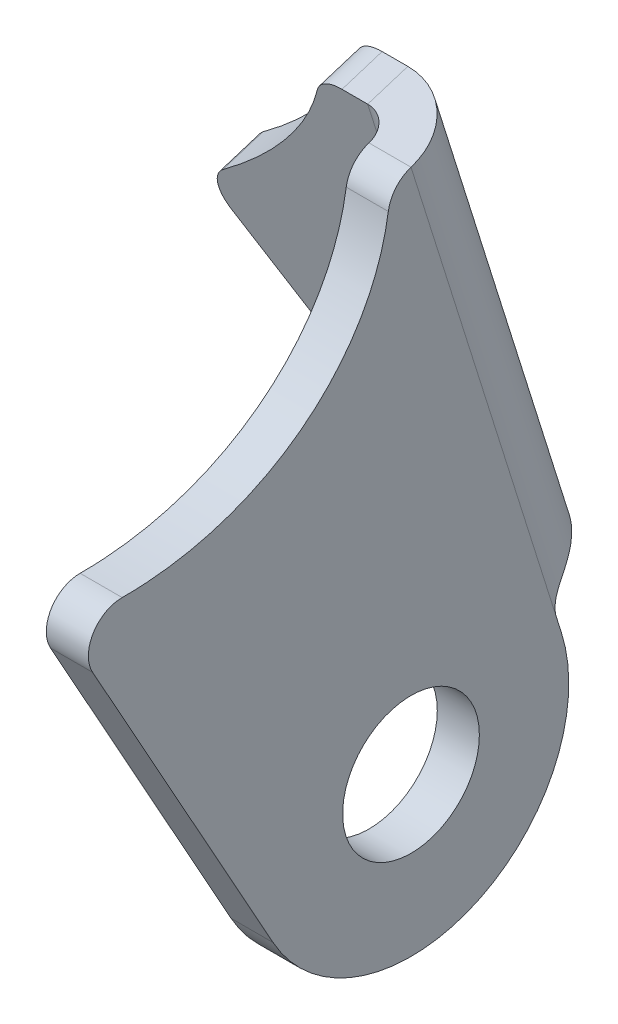
ISO-10303-21;
HEADER;
FILE_DESCRIPTION(('STEP AP214'),'2;1');
FILE_NAME('part.step','',(''),(''),'','','');
FILE_SCHEMA(('AUTOMOTIVE_DESIGN { 1 0 10303 214 1 1 1 1 }'));
ENDSEC;
DATA;
#1=APPLICATION_CONTEXT('core data for automotive mechanical design processes');
#2=APPLICATION_PROTOCOL_DEFINITION('international standard','automotive_design',2000,#1);
#3=PRODUCT_CONTEXT('',#1,'mechanical');
#4=PRODUCT('Part','Part','',(#3));
#5=PRODUCT_RELATED_PRODUCT_CATEGORY('part','',(#4));
#6=PRODUCT_DEFINITION_FORMATION('','',#4);
#7=PRODUCT_DEFINITION_CONTEXT('part definition',#1,'design');
#8=PRODUCT_DEFINITION('design','',#6,#7);
#9=PRODUCT_DEFINITION_SHAPE('','',#8);
#10=(LENGTH_UNIT() NAMED_UNIT(*) SI_UNIT(.MILLI.,.METRE.));
#11=(NAMED_UNIT(*) PLANE_ANGLE_UNIT() SI_UNIT($,.RADIAN.));
#12=(NAMED_UNIT(*) SI_UNIT($,.STERADIAN.) SOLID_ANGLE_UNIT());
#13=UNCERTAINTY_MEASURE_WITH_UNIT(LENGTH_MEASURE(1.E-05),#10,'distance_accuracy_value','');
#14=(GEOMETRIC_REPRESENTATION_CONTEXT(3) GLOBAL_UNCERTAINTY_ASSIGNED_CONTEXT((#13)) GLOBAL_UNIT_ASSIGNED_CONTEXT((#10,
#11,#12)) REPRESENTATION_CONTEXT('',''));
#15=CARTESIAN_POINT('',(0.,0.,0.));
#16=DIRECTION('',(0.,0.,1.));
#17=DIRECTION('',(1.,0.,0.));
#18=AXIS2_PLACEMENT_3D('',#15,#16,#17);
#19=CARTESIAN_POINT('',(472.519375,274.953876558,-153.162384053848));
#20=DIRECTION('',(0.,-0.953939201416946,-0.300000000000001));
#21=DIRECTION('',(0.,0.300000000000001,-0.953939201416946));
#22=AXIS2_PLACEMENT_3D('',#19,#20,#21);
#23=PLANE('',#22);
#24=DIRECTION('',(1.,0.,0.));
#25=VECTOR('',#24,1.);
#26=CARTESIAN_POINT('',(1.66533453693773E-12,274.953876558001,-153.162384053851));
#27=LINE('',#26,#25);
#28=CARTESIAN_POINT('',(469.380261929001,274.953876558,-153.162384053848));
#29=VERTEX_POINT('',#28);
#30=CARTESIAN_POINT('',(470.931875,274.953876558,-153.162384053848));
#31=VERTEX_POINT('',#30);
#32=EDGE_CURVE('E83',#29,#31,#27,.T.);
#33=ORIENTED_EDGE('',*,*,#32,.F.);
#34=DIRECTION('',(0.,0.300000000000001,-0.953939201416946));
#35=VECTOR('',#34,1.);
#36=CARTESIAN_POINT('',(469.380261929001,274.191876558,-150.739378482249));
#37=LINE('',#36,#35);
#38=CARTESIAN_POINT('',(469.380261929001,274.191876558,-150.739378482249));
#39=VERTEX_POINT('',#38);
#40=EDGE_CURVE('E210',#29,#39,#37,.F.);
#41=ORIENTED_EDGE('',*,*,#40,.T.);
#42=DIRECTION('',(-1.,0.,0.));
#43=VECTOR('',#42,1.);
#44=CARTESIAN_POINT('',(472.519375,274.191876558,-150.739378482249));
#45=LINE('',#44,#43);
#46=CARTESIAN_POINT('',(470.931875,274.191876558,-150.739378482249));
#47=VERTEX_POINT('',#46);
#48=EDGE_CURVE('E690',#39,#47,#45,.F.);
#49=ORIENTED_EDGE('',*,*,#48,.T.);
#50=DIRECTION('',(0.,0.300000000000001,-0.953939201416946));
#51=VECTOR('',#50,1.);
#52=CARTESIAN_POINT('',(470.931875,274.953876558,-153.162384053848));
#53=LINE('',#52,#51);
#54=EDGE_CURVE('E13',#47,#31,#53,.T.);
#55=ORIENTED_EDGE('',*,*,#54,.T.);
#56=EDGE_LOOP('',(#33,#41,#49,#55));
#57=FACE_BOUND('',#56,.T.);
#58=ADVANCED_FACE('F68',(#57),#23,.F.);
#59=CARTESIAN_POINT('',(447.119375,274.953876558,-153.162384053848));
#60=DIRECTION('',(0.795628229877527,0.577882258801892,0.181735562793793));
#61=DIRECTION('',(-0.587668443577206,0.809101847991676,0.));
#62=AXIS2_PLACEMENT_3D('',#59,#60,#61);
#63=PLANE('',#62);
#64=DIRECTION('',(-0.605785209312635,0.758980958234147,0.238688468963255));
#65=VECTOR('',#64,1.);
#66=CARTESIAN_POINT('',(387.309206328094,349.889313133379,-129.596279485317));
#67=LINE('',#66,#65);
#68=CARTESIAN_POINT('',(467.146965918821,249.861550246608,-161.053555610942));
#69=VERTEX_POINT('',#68);
#70=CARTESIAN_POINT('',(458.309753270916,260.933587035416,-157.571561127741));
#71=VERTEX_POINT('',#70);
#72=EDGE_CURVE('E693',#69,#71,#67,.T.);
#73=ORIENTED_EDGE('',*,*,#72,.F.);
#74=DIRECTION('',(0.,-0.300000000000001,0.953939201416945));
#75=VECTOR('',#74,1.);
#76=CARTESIAN_POINT('',(467.146965918821,249.861550246607,-161.053555610942));
#77=LINE('',#76,#75);
#78=CARTESIAN_POINT('',(467.146965918821,249.099550246607,-158.630550039343));
#79=VERTEX_POINT('',#78);
#80=EDGE_CURVE('E397',#69,#79,#77,.T.);
#81=ORIENTED_EDGE('',*,*,#80,.T.);
#82=DIRECTION('',(0.605785209312635,-0.758980958234147,-0.238688468963255));
#83=VECTOR('',#82,1.);
#84=CARTESIAN_POINT('',(447.119375,274.191876558,-150.739378482249));
#85=LINE('',#84,#83);
#86=CARTESIAN_POINT('',(458.309753270916,260.171587035416,-155.148555556142));
#87=VERTEX_POINT('',#86);
#88=EDGE_CURVE('E198',#79,#87,#85,.F.);
#89=ORIENTED_EDGE('',*,*,#88,.T.);
#90=DIRECTION('',(0.,0.3,-0.953939201416946));
#91=VECTOR('',#90,1.);
#92=CARTESIAN_POINT('',(458.309753270916,260.933587035416,-157.571561127741));
#93=LINE('',#92,#91);
#94=EDGE_CURVE('E390',#87,#71,#93,.T.);
#95=ORIENTED_EDGE('',*,*,#94,.T.);
#96=EDGE_LOOP('',(#73,#81,#89,#95));
#97=FACE_BOUND('',#96,.T.);
#98=ADVANCED_FACE('F367',(#97),#63,.F.);
#99=CARTESIAN_POINT('',(467.756875,249.097402539214,-161.293868947345));
#100=DIRECTION('',(0.,0.953939201416946,0.300000000000001));
#101=DIRECTION('',(0.,-0.300000000000001,0.953939201416946));
#102=AXIS2_PLACEMENT_3D('',#99,#100,#101);
#103=PLANE('',#102);
#104=DIRECTION('',(1.,0.,0.));
#105=VECTOR('',#104,1.);
#106=CARTESIAN_POINT('',(467.756875,248.335402539214,-158.870863375746));
#107=LINE('',#106,#105);
#108=CARTESIAN_POINT('',(470.931875,248.335402539214,-158.870863375746));
#109=VERTEX_POINT('',#108);
#110=CARTESIAN_POINT('',(468.763682481932,248.335402539214,-158.870863375746));
#111=VERTEX_POINT('',#110);
#112=EDGE_CURVE('E182',#109,#111,#107,.F.);
#113=ORIENTED_EDGE('',*,*,#112,.T.);
#114=DIRECTION('',(0.,-0.300000000000001,0.953939201416945));
#115=VECTOR('',#114,1.);
#116=CARTESIAN_POINT('',(468.763682481932,249.097402539214,-161.293868947345));
#117=LINE('',#116,#115);
#118=CARTESIAN_POINT('',(468.763682481932,249.097402539214,-161.293868947345));
#119=VERTEX_POINT('',#118);
#120=EDGE_CURVE('E395',#111,#119,#117,.F.);
#121=ORIENTED_EDGE('',*,*,#120,.T.);
#122=DIRECTION('',(-1.,0.,0.));
#123=VECTOR('',#122,1.);
#124=CARTESIAN_POINT('',(9.99200722162641E-13,249.097402539214,-161.293868947347));
#125=LINE('',#124,#123);
#126=CARTESIAN_POINT('',(470.931875,249.097402539214,-161.293868947345));
#127=VERTEX_POINT('',#126);
#128=EDGE_CURVE('E90',#127,#119,#125,.T.);
#129=ORIENTED_EDGE('',*,*,#128,.F.);
#130=DIRECTION('',(0.,0.300000000000001,-0.953939201416946));
#131=VECTOR('',#130,1.);
#132=CARTESIAN_POINT('',(470.931875,248.335402539214,-158.870863375746));
#133=LINE('',#132,#131);
#134=EDGE_CURVE('E179',#109,#127,#133,.T.);
#135=ORIENTED_EDGE('',*,*,#134,.F.);
#136=EDGE_LOOP('',(#113,#121,#129,#135));
#137=FACE_BOUND('',#136,.T.);
#138=ADVANCED_FACE('F181',(#137),#103,.F.);
#139=CARTESIAN_POINT('',(1.33226762955019E-12,68.578129589654,-218.064553918074));
#140=DIRECTION('',(0.,-0.300000000000001,0.953939201416946));
#141=DIRECTION('',(0.,-0.953939201416946,-0.300000000000001));
#142=AXIS2_PLACEMENT_3D('',#139,#140,#141);
#143=PLANE('',#142);
#144=ORIENTED_EDGE('',*,*,#128,.T.);
#145=CARTESIAN_POINT('',(468.763682481932,251.035806996493,-160.684268947345));
#146=DIRECTION('',(0.,-0.300000000000001,0.953939201416946));
#147=DIRECTION('',(0.953939201416945,0.286181760425085,0.0900000000000061));
#148=AXIS2_PLACEMENT_3D('',#145,#146,#147);
#149=CIRCLE('',#148,2.032);
#150=EDGE_CURVE('E406',#119,#69,#149,.F.);
#151=ORIENTED_EDGE('',*,*,#150,.T.);
#152=ORIENTED_EDGE('',*,*,#72,.T.);
#153=CARTESIAN_POINT('',(459.926469834027,262.107843785302,-157.202274464144));
#154=DIRECTION('',(0.,-0.300000000000001,0.953939201416946));
#155=DIRECTION('',(0.953939201416945,0.286181760425085,0.0900000000000061));
#156=AXIS2_PLACEMENT_3D('',#153,#154,#155);
#157=CIRCLE('',#156,2.032);
#158=CARTESIAN_POINT('',(458.615876339165,263.589176127829,-156.736416994299));
#159=VERTEX_POINT('',#158);
#160=EDGE_CURVE('E404',#71,#159,#157,.F.);
#161=ORIENTED_EDGE('',*,*,#160,.T.);
#162=CARTESIAN_POINT('',(433.841055893317,266.765989850092,-155.737355298058));
#163=DIRECTION('',(0.,-0.300000000000001,0.953939201416946));
#164=DIRECTION('',(0.91475563366351,0.385398675295584,0.121202276221528));
#165=AXIS2_PLACEMENT_3D('',#162,#163,#164);
#166=ELLIPSE('',#165,37.4703983980415,15.875);
#167=CARTESIAN_POINT('',(467.532869233194,273.822757333464,-153.51810459333));
#168=VERTEX_POINT('',#167);
#169=EDGE_CURVE('E199',#159,#168,#166,.T.);
#170=ORIENTED_EDGE('',*,*,#169,.T.);
#171=CARTESIAN_POINT('',(469.380261929001,273.015472100721,-153.771984053848));
#172=DIRECTION('',(0.,-0.300000000000001,0.953939201416946));
#173=DIRECTION('',(0.953939201416945,0.286181760425085,0.0900000000000061));
#174=AXIS2_PLACEMENT_3D('',#171,#172,#173);
#175=CIRCLE('',#174,2.032);
#176=EDGE_CURVE('E402',#168,#29,#175,.F.);
#177=ORIENTED_EDGE('',*,*,#176,.T.);
#178=ORIENTED_EDGE('',*,*,#32,.T.);
#179=DIRECTION('',(0.,0.953939201416946,0.300000000000001));
#180=VECTOR('',#179,1.);
#181=CARTESIAN_POINT('',(470.931875,274.953876558,-153.162384053848));
#182=LINE('',#181,#180);
#183=EDGE_CURVE('E76',#127,#31,#182,.T.);
#184=ORIENTED_EDGE('',*,*,#183,.F.);
#185=EDGE_LOOP('',(#144,#151,#152,#161,#170,#177,#178,#184));
#186=FACE_BOUND('',#185,.T.);
#187=ADVANCED_FACE('F360',(#186),#143,.F.);
#188=CARTESIAN_POINT('',(1.33226762955019E-12,67.8161295896539,-215.641548346475));
#189=DIRECTION('',(0.,-0.300000000000001,0.953939201416946));
#190=DIRECTION('',(0.,-0.953939201416946,-0.300000000000001));
#191=AXIS2_PLACEMENT_3D('',#188,#189,#190);
#192=PLANE('',#191);
#193=ORIENTED_EDGE('',*,*,#88,.F.);
#194=CARTESIAN_POINT('',(468.763682481932,250.273806996493,-158.261263375746));
#195=DIRECTION('',(0.,-0.300000000000001,0.953939201416946));
#196=DIRECTION('',(0.953939201416945,0.286181760425085,0.0900000000000061));
#197=AXIS2_PLACEMENT_3D('',#194,#195,#196);
#198=CIRCLE('',#197,2.032);
#199=EDGE_CURVE('E197',#79,#111,#198,.T.);
#200=ORIENTED_EDGE('',*,*,#199,.T.);
#201=ORIENTED_EDGE('',*,*,#112,.F.);
#202=DIRECTION('',(0.,-0.953939201416946,-0.300000000000001));
#203=VECTOR('',#202,1.);
#204=CARTESIAN_POINT('',(470.931875,274.191876558,-150.739378482249));
#205=LINE('',#204,#203);
#206=EDGE_CURVE('E188',#47,#109,#205,.T.);
#207=ORIENTED_EDGE('',*,*,#206,.F.);
#208=ORIENTED_EDGE('',*,*,#48,.F.);
#209=CARTESIAN_POINT('',(469.380261929001,272.253472100721,-151.348978482249));
#210=DIRECTION('',(0.,-0.300000000000001,0.953939201416946));
#211=DIRECTION('',(0.953939201416945,0.286181760425085,0.0900000000000061));
#212=AXIS2_PLACEMENT_3D('',#209,#210,#211);
#213=CIRCLE('',#212,2.032);
#214=CARTESIAN_POINT('',(467.532869233194,273.060757333464,-151.095099021731));
#215=VERTEX_POINT('',#214);
#216=EDGE_CURVE('E393',#39,#215,#213,.T.);
#217=ORIENTED_EDGE('',*,*,#216,.T.);
#218=CARTESIAN_POINT('',(433.841055893317,266.003989850092,-153.314349726459));
#219=DIRECTION('',(0.,-0.300000000000001,0.953939201416946));
#220=DIRECTION('',(0.91475563366351,0.385398675295584,0.121202276221528));
#221=AXIS2_PLACEMENT_3D('',#218,#219,#220);
#222=ELLIPSE('',#221,37.4703983980415,15.875);
#223=CARTESIAN_POINT('',(458.615876339165,262.827176127829,-154.3134114227));
#224=VERTEX_POINT('',#223);
#225=EDGE_CURVE('E347',#224,#215,#222,.T.);
#226=ORIENTED_EDGE('',*,*,#225,.F.);
#227=CARTESIAN_POINT('',(459.926469834027,261.345843785302,-154.779268892545));
#228=DIRECTION('',(0.,-0.300000000000001,0.953939201416946));
#229=DIRECTION('',(0.953939201416945,0.286181760425085,0.0900000000000061));
#230=AXIS2_PLACEMENT_3D('',#227,#228,#229);
#231=CIRCLE('',#230,2.032);
#232=EDGE_CURVE('E387',#224,#87,#231,.T.);
#233=ORIENTED_EDGE('',*,*,#232,.T.);
#234=EDGE_LOOP('',(#193,#200,#201,#207,#208,#217,#226,#233));
#235=FACE_BOUND('',#234,.T.);
#236=ADVANCED_FACE('F194',(#235),#192,.T.);
#237=CARTESIAN_POINT('',(433.841055893317,266.003989850092,-153.314349726459));
#238=DIRECTION('',(0.,-0.300000000000001,0.953939201416946));
#239=DIRECTION('',(0.91475563366351,0.385398675295584,0.121202276221528));
#240=AXIS2_PLACEMENT_3D('',#237,#238,#239);
#241=ELLIPSE('',#240,37.4703983980415,15.875);
#242=DIRECTION('',(0.,-0.300000000000001,0.953939201416946));
#243=VECTOR('',#242,1.);
#244=SURFACE_OF_LINEAR_EXTRUSION('',#241,#243);
#245=ORIENTED_EDGE('',*,*,#169,.F.);
#246=DIRECTION('',(0.,-0.300000000000001,0.953939201416946));
#247=VECTOR('',#246,1.);
#248=CARTESIAN_POINT('',(458.615876339165,263.589176127829,-156.736416994299));
#249=LINE('',#248,#247);
#250=EDGE_CURVE('E388',#159,#224,#249,.T.);
#251=ORIENTED_EDGE('',*,*,#250,.T.);
#252=ORIENTED_EDGE('',*,*,#225,.T.);
#253=DIRECTION('',(0.,-0.300000000000001,0.953939201416946));
#254=VECTOR('',#253,1.);
#255=CARTESIAN_POINT('',(467.532869233194,273.060757333464,-151.095099021731));
#256=LINE('',#255,#254);
#257=EDGE_CURVE('E408',#215,#168,#256,.F.);
#258=ORIENTED_EDGE('',*,*,#257,.T.);
#259=EDGE_LOOP('',(#245,#251,#252,#258));
#260=FACE_BOUND('',#259,.T.);
#261=ADVANCED_FACE('F354',(#260),#244,.F.);
#262=CARTESIAN_POINT('',(468.763682481932,251.035806996493,-160.684268947345));
#263=DIRECTION('',(0.,-0.300000000000001,0.953939201416945));
#264=DIRECTION('',(0.953939201416945,0.286181760425085,0.0900000000000042));
#265=AXIS2_PLACEMENT_3D('',#262,#263,#264);
#266=CYLINDRICAL_SURFACE('',#265,2.032);
#267=ORIENTED_EDGE('',*,*,#150,.F.);
#268=ORIENTED_EDGE('',*,*,#120,.F.);
#269=ORIENTED_EDGE('',*,*,#199,.F.);
#270=ORIENTED_EDGE('',*,*,#80,.F.);
#271=EDGE_LOOP('',(#267,#268,#269,#270));
#272=FACE_BOUND('',#271,.T.);
#273=ADVANCED_FACE('F357',(#272),#266,.T.);
#274=CARTESIAN_POINT('',(459.926469834027,261.726843785302,-155.990771678345));
#275=DIRECTION('',(0.,-0.300000000000001,0.953939201416946));
#276=DIRECTION('',(0.953939201416945,0.286181760425085,0.0900000000000061));
#277=AXIS2_PLACEMENT_3D('',#274,#275,#276);
#278=CYLINDRICAL_SURFACE('',#277,2.032);
#279=ORIENTED_EDGE('',*,*,#232,.F.);
#280=ORIENTED_EDGE('',*,*,#250,.F.);
#281=ORIENTED_EDGE('',*,*,#160,.F.);
#282=ORIENTED_EDGE('',*,*,#94,.F.);
#283=EDGE_LOOP('',(#279,#280,#281,#282));
#284=FACE_BOUND('',#283,.T.);
#285=ADVANCED_FACE('F375',(#284),#278,.T.);
#286=CARTESIAN_POINT('',(469.380261929001,272.634472100721,-152.560481268049));
#287=DIRECTION('',(0.,-0.300000000000001,0.953939201416946));
#288=DIRECTION('',(0.953939201416945,0.286181760425085,0.0900000000000061));
#289=AXIS2_PLACEMENT_3D('',#286,#287,#288);
#290=CYLINDRICAL_SURFACE('',#289,2.032);
#291=ORIENTED_EDGE('',*,*,#216,.F.);
#292=ORIENTED_EDGE('',*,*,#40,.F.);
#293=ORIENTED_EDGE('',*,*,#176,.F.);
#294=ORIENTED_EDGE('',*,*,#257,.F.);
#295=EDGE_LOOP('',(#291,#292,#293,#294));
#296=FACE_BOUND('',#295,.T.);
#297=ADVANCED_FACE('F70',(#296),#290,.T.);
#298=CARTESIAN_POINT('',(473.789375,257.900051140314,-131.779385802766));
#299=DIRECTION('',(-1.,0.,0.));
#300=DIRECTION('',(0.,0.,1.));
#301=AXIS2_PLACEMENT_3D('',#298,#299,#300);
#302=CYLINDRICAL_SURFACE('',#301,2.032);
#303=CARTESIAN_POINT('',(472.519375,257.900051140314,-131.779385802766));
#304=DIRECTION('',(-1.,0.,0.));
#305=DIRECTION('',(0.,0.,1.));
#306=AXIS2_PLACEMENT_3D('',#303,#304,#305);
#307=CIRCLE('',#306,2.032);
#308=CARTESIAN_POINT('',(472.519375,256.911736933325,-130.00392557278));
#309=VERTEX_POINT('',#308);
#310=CARTESIAN_POINT('',(472.519375,259.932034390258,-131.787636375182));
#311=VERTEX_POINT('',#310);
#312=EDGE_CURVE('E438',#309,#311,#307,.T.);
#313=ORIENTED_EDGE('',*,*,#312,.F.);
#314=DIRECTION('',(-1.,0.,0.));
#315=VECTOR('',#314,1.);
#316=CARTESIAN_POINT('',(472.519375,256.911736933325,-130.00392557278));
#317=LINE('',#316,#315);
#318=CARTESIAN_POINT('',(475.059375,256.911736933325,-130.00392557278));
#319=VERTEX_POINT('',#318);
#320=EDGE_CURVE('E420',#319,#309,#317,.T.);
#321=ORIENTED_EDGE('',*,*,#320,.F.);
#322=CARTESIAN_POINT('',(475.059375,257.900051140314,-131.779385802766));
#323=DIRECTION('',(-1.,0.,0.));
#324=DIRECTION('',(0.,0.,1.));
#325=AXIS2_PLACEMENT_3D('',#322,#323,#324);
#326=CIRCLE('',#325,2.032);
#327=CARTESIAN_POINT('',(475.059375,259.932034390258,-131.787636375182));
#328=VERTEX_POINT('',#327);
#329=EDGE_CURVE('E488',#328,#319,#326,.F.);
#330=ORIENTED_EDGE('',*,*,#329,.F.);
#331=DIRECTION('',(-1.,0.,0.));
#332=VECTOR('',#331,1.);
#333=CARTESIAN_POINT('',(472.519375,259.932034390258,-131.787636375182));
#334=LINE('',#333,#332);
#335=EDGE_CURVE('E454',#311,#328,#334,.F.);
#336=ORIENTED_EDGE('',*,*,#335,.F.);
#337=EDGE_LOOP('',(#313,#321,#330,#336));
#338=FACE_BOUND('',#337,.T.);
#339=ADVANCED_FACE('F382',(#338),#302,.T.);
#340=CARTESIAN_POINT('',(472.519375,273.715626558,-120.65));
#341=DIRECTION('',(0.,-0.486375101864288,0.873750113182541));
#342=DIRECTION('',(0.,-0.873750113182541,-0.486375101864288));
#343=AXIS2_PLACEMENT_3D('',#340,#341,#342);
#344=PLANE('',#343);
#345=DIRECTION('',(0.,-0.873750113182541,-0.486375101864288));
#346=VECTOR('',#345,1.);
#347=CARTESIAN_POINT('',(475.059375,273.715626558,-120.65));
#348=LINE('',#347,#346);
#349=CARTESIAN_POINT('',(475.059375,237.332903712743,-140.902530171936));
#350=VERTEX_POINT('',#349);
#351=EDGE_CURVE('E486',#319,#350,#348,.T.);
#352=ORIENTED_EDGE('',*,*,#351,.F.);
#353=ORIENTED_EDGE('',*,*,#320,.T.);
#354=DIRECTION('',(0.,-0.873750113182541,-0.486375101864288));
#355=VECTOR('',#354,1.);
#356=CARTESIAN_POINT('',(472.519375,273.715626558,-120.65));
#357=LINE('',#356,#355);
#358=CARTESIAN_POINT('',(472.519375,237.332903712743,-140.902530171936));
#359=VERTEX_POINT('',#358);
#360=EDGE_CURVE('E422',#309,#359,#357,.T.);
#361=ORIENTED_EDGE('',*,*,#360,.T.);
#362=DIRECTION('',(1.,0.,0.));
#363=VECTOR('',#362,1.);
#364=CARTESIAN_POINT('',(472.519375,237.332903712743,-140.902530171936));
#365=LINE('',#364,#363);
#366=EDGE_CURVE('E467',#359,#350,#365,.T.);
#367=ORIENTED_EDGE('',*,*,#366,.T.);
#368=EDGE_LOOP('',(#352,#353,#361,#367));
#369=FACE_BOUND('',#368,.T.);
#370=ADVANCED_FACE('F473',(#369),#344,.T.);
#371=CARTESIAN_POINT('',(472.519375,241.965626558,-149.225));
#372=DIRECTION('',(1.,0.,0.));
#373=DIRECTION('',(0.,0.,-1.));
#374=AXIS2_PLACEMENT_3D('',#371,#372,#373);
#375=CYLINDRICAL_SURFACE('',#374,9.52500000000001);
#376=CARTESIAN_POINT('',(475.059375,241.965626558,-149.225));
#377=DIRECTION('',(1.,0.,0.));
#378=DIRECTION('',(0.,0.,1.));
#379=AXIS2_PLACEMENT_3D('',#376,#377,#378);
#380=CIRCLE('',#379,9.52500000000001);
#381=CARTESIAN_POINT('',(475.059375,244.823126558,-158.311270893496));
#382=VERTEX_POINT('',#381);
#383=EDGE_CURVE('E481',#350,#382,#380,.T.);
#384=ORIENTED_EDGE('',*,*,#383,.F.);
#385=ORIENTED_EDGE('',*,*,#366,.F.);
#386=CARTESIAN_POINT('',(472.519375,241.965626558,-149.225));
#387=DIRECTION('',(1.,0.,0.));
#388=DIRECTION('',(0.,0.,1.));
#389=AXIS2_PLACEMENT_3D('',#386,#387,#388);
#390=CIRCLE('',#389,9.52500000000001);
#391=CARTESIAN_POINT('',(472.519375,244.823126558,-158.311270893496));
#392=VERTEX_POINT('',#391);
#393=EDGE_CURVE('E464',#359,#392,#390,.T.);
#394=ORIENTED_EDGE('',*,*,#393,.T.);
#395=DIRECTION('',(1.,0.,0.));
#396=VECTOR('',#395,1.);
#397=CARTESIAN_POINT('',(472.519375,244.823126558,-158.311270893496));
#398=LINE('',#397,#396);
#399=EDGE_CURVE('E462',#392,#382,#398,.T.);
#400=ORIENTED_EDGE('',*,*,#399,.T.);
#401=EDGE_LOOP('',(#384,#385,#394,#400));
#402=FACE_BOUND('',#401,.T.);
#403=ADVANCED_FACE('F311',(#402),#375,.T.);
#404=CARTESIAN_POINT('',(472.519375,276.366759756375,-129.324113696996));
#405=DIRECTION('',(-1.,0.,0.));
#406=DIRECTION('',(0.,0.396544052208595,0.91801569412401));
#407=AXIS2_PLACEMENT_3D('',#404,#405,#406);
#408=ELLIPSE('',#407,19.1587804270777,15.875);
#409=DIRECTION('',(-1.,0.,0.));
#410=VECTOR('',#409,1.);
#411=SURFACE_OF_LINEAR_EXTRUSION('',#408,#410);
#412=CARTESIAN_POINT('',(475.059375,276.366759756375,-129.324113696996));
#413=DIRECTION('',(-1.,0.,0.));
#414=DIRECTION('',(0.,0.396544052208595,0.91801569412401));
#415=AXIS2_PLACEMENT_3D('',#412,#413,#414);
#416=ELLIPSE('',#415,19.1587804270777,15.875);
#417=CARTESIAN_POINT('',(475.059375,272.085989306741,-147.855143440128));
#418=VERTEX_POINT('',#417);
#419=EDGE_CURVE('E433',#418,#328,#416,.T.);
#420=ORIENTED_EDGE('',*,*,#419,.F.);
#421=DIRECTION('',(-1.,0.,0.));
#422=VECTOR('',#421,1.);
#423=CARTESIAN_POINT('',(475.059375,272.085989306741,-147.855143440128));
#424=LINE('',#423,#422);
#425=CARTESIAN_POINT('',(472.519375,272.085989306741,-147.855143440128));
#426=VERTEX_POINT('',#425);
#427=EDGE_CURVE('E460',#418,#426,#424,.T.);
#428=ORIENTED_EDGE('',*,*,#427,.T.);
#429=CARTESIAN_POINT('',(472.519375,276.366759756375,-129.324113696996));
#430=DIRECTION('',(-1.,0.,0.));
#431=DIRECTION('',(0.,0.396544052208595,0.91801569412401));
#432=AXIS2_PLACEMENT_3D('',#429,#430,#431);
#433=ELLIPSE('',#432,19.1587804270777,15.875);
#434=EDGE_CURVE('E457',#426,#311,#433,.T.);
#435=ORIENTED_EDGE('',*,*,#434,.T.);
#436=ORIENTED_EDGE('',*,*,#335,.T.);
#437=EDGE_LOOP('',(#420,#428,#435,#436));
#438=FACE_BOUND('',#437,.T.);
#439=ADVANCED_FACE('F306',(#438),#411,.F.);
#440=CARTESIAN_POINT('',(472.519375,241.965626558,-149.225));
#441=DIRECTION('',(1.,0.,0.));
#442=DIRECTION('',(0.,0.,-1.));
#443=AXIS2_PLACEMENT_3D('',#440,#441,#442);
#444=CYLINDRICAL_SURFACE('',#443,4.1275);
#445=CARTESIAN_POINT('',(472.519375,241.965626558,-149.225));
#446=DIRECTION('',(1.,0.,0.));
#447=DIRECTION('',(0.,0.,-1.));
#448=AXIS2_PLACEMENT_3D('',#445,#446,#447);
#449=CIRCLE('',#448,4.1275);
#450=CARTESIAN_POINT('',(472.519375,241.965626558,-153.3525));
#451=VERTEX_POINT('',#450);
#452=EDGE_CURVE('E448',#451,#451,#449,.T.);
#453=ORIENTED_EDGE('',*,*,#452,.F.);
#454=EDGE_LOOP('',(#453));
#455=FACE_BOUND('',#454,.T.);
#456=CARTESIAN_POINT('',(475.059375,241.965626558,-149.225));
#457=DIRECTION('',(1.,0.,0.));
#458=DIRECTION('',(0.,0.,-1.));
#459=AXIS2_PLACEMENT_3D('',#456,#457,#458);
#460=CIRCLE('',#459,4.1275);
#461=CARTESIAN_POINT('',(475.059375,241.965626558,-153.3525));
#462=VERTEX_POINT('',#461);
#463=EDGE_CURVE('E451',#462,#462,#460,.T.);
#464=ORIENTED_EDGE('',*,*,#463,.T.);
#465=EDGE_LOOP('',(#464));
#466=FACE_BOUND('',#465,.T.);
#467=ADVANCED_FACE('F310',(#455,#466),#444,.F.);
#468=CARTESIAN_POINT('',(472.519375,241.965626558,-149.225));
#469=DIRECTION('',(-1.,0.,0.));
#470=DIRECTION('',(0.,0.,1.));
#471=AXIS2_PLACEMENT_3D('',#468,#469,#470);
#472=PLANE('',#471);
#473=ORIENTED_EDGE('',*,*,#452,.T.);
#474=EDGE_LOOP('',(#473));
#475=FACE_BOUND('',#474,.T.);
#476=ORIENTED_EDGE('',*,*,#434,.F.);
#477=CARTESIAN_POINT('',(472.519375,271.787057313123,-149.865034895702));
#478=DIRECTION('',(-1.,0.,0.));
#479=DIRECTION('',(0.,0.,1.));
#480=AXIS2_PLACEMENT_3D('',#477,#478,#479);
#481=CIRCLE('',#480,2.032);
#482=CARTESIAN_POINT('',(472.519375,273.715626558,-149.225));
#483=VERTEX_POINT('',#482);
#484=EDGE_CURVE('E441',#426,#483,#481,.T.);
#485=ORIENTED_EDGE('',*,*,#484,.T.);
#486=DIRECTION('',(0.,0.953939201416945,0.300000000000003));
#487=VECTOR('',#486,1.);
#488=CARTESIAN_POINT('',(472.519375,247.859152539214,-157.356484893496));
#489=LINE('',#488,#487);
#490=CARTESIAN_POINT('',(472.519375,245.920748081935,-157.966084893496));
#491=VERTEX_POINT('',#490);
#492=EDGE_CURVE('E335',#491,#483,#489,.T.);
#493=ORIENTED_EDGE('',*,*,#492,.F.);
#494=DIRECTION('',(0.,0.953939201416945,0.300000000000001));
#495=VECTOR('',#494,1.);
#496=CARTESIAN_POINT('',(472.519375,244.823126558,-158.311270893496));
#497=LINE('',#496,#495);
#498=EDGE_CURVE('E435',#392,#491,#497,.T.);
#499=ORIENTED_EDGE('',*,*,#498,.F.);
#500=ORIENTED_EDGE('',*,*,#393,.F.);
#501=ORIENTED_EDGE('',*,*,#360,.F.);
#502=ORIENTED_EDGE('',*,*,#312,.T.);
#503=EDGE_LOOP('',(#476,#485,#493,#499,#500,#501,#502));
#504=FACE_BOUND('',#503,.T.);
#505=ADVANCED_FACE('F316',(#475,#504),#472,.T.);
#506=CARTESIAN_POINT('',(472.519375,244.823126558,-158.311270893496));
#507=DIRECTION('',(0.,0.3,-0.953939201416945));
#508=DIRECTION('',(0.,0.953939201416946,0.300000000000001));
#509=AXIS2_PLACEMENT_3D('',#506,#507,#508);
#510=PLANE('',#509);
#511=ORIENTED_EDGE('',*,*,#498,.T.);
#512=CARTESIAN_POINT('',(475.059375,245.920748081934,-157.966084893496));
#513=CARTESIAN_POINT('',(472.519375,245.920748081935,-157.966084893496));
#514=B_SPLINE_CURVE_WITH_KNOTS('',1,(#512,#513),.UNSPECIFIED.,.F.,.F.,(2,2),(0.,1.),.UNSPECIFIED.);
#515=CARTESIAN_POINT('',(475.059375,245.920750825387,-157.96608403072));
#516=VERTEX_POINT('',#515);
#517=EDGE_CURVE('E429',#491,#516,#514,.F.);
#518=ORIENTED_EDGE('',*,*,#517,.T.);
#519=DIRECTION('',(0.,0.953939201416945,0.300000000000001));
#520=VECTOR('',#519,1.);
#521=CARTESIAN_POINT('',(475.059375,244.823126558,-158.311270893496));
#522=LINE('',#521,#520);
#523=EDGE_CURVE('E303',#382,#516,#522,.T.);
#524=ORIENTED_EDGE('',*,*,#523,.F.);
#525=ORIENTED_EDGE('',*,*,#399,.F.);
#526=EDGE_LOOP('',(#511,#518,#524,#525));
#527=FACE_BOUND('',#526,.T.);
#528=ADVANCED_FACE('F320',(#527),#510,.T.);
#529=CARTESIAN_POINT('',(475.059375,241.965626558,-149.225));
#530=DIRECTION('',(-1.,0.,0.));
#531=DIRECTION('',(0.,0.,1.));
#532=AXIS2_PLACEMENT_3D('',#529,#530,#531);
#533=PLANE('',#532);
#534=DIRECTION('',(0.,0.953939201416945,0.300000000000003));
#535=VECTOR('',#534,1.);
#536=CARTESIAN_POINT('',(475.059375,247.859152539214,-157.356484893496));
#537=LINE('',#536,#535);
#538=CARTESIAN_POINT('',(475.059375,273.715626558,-149.225));
#539=VERTEX_POINT('',#538);
#540=EDGE_CURVE('E426',#516,#539,#537,.T.);
#541=ORIENTED_EDGE('',*,*,#540,.T.);
#542=CARTESIAN_POINT('',(475.059375,271.787057313123,-149.865034895702));
#543=DIRECTION('',(-1.,0.,0.));
#544=DIRECTION('',(0.,0.,1.));
#545=AXIS2_PLACEMENT_3D('',#542,#543,#544);
#546=CIRCLE('',#545,2.032);
#547=EDGE_CURVE('E428',#539,#418,#546,.F.);
#548=ORIENTED_EDGE('',*,*,#547,.T.);
#549=ORIENTED_EDGE('',*,*,#419,.T.);
#550=ORIENTED_EDGE('',*,*,#329,.T.);
#551=ORIENTED_EDGE('',*,*,#351,.T.);
#552=ORIENTED_EDGE('',*,*,#383,.T.);
#553=ORIENTED_EDGE('',*,*,#523,.T.);
#554=EDGE_LOOP('',(#541,#548,#549,#550,#551,#552,#553));
#555=FACE_BOUND('',#554,.T.);
#556=ORIENTED_EDGE('',*,*,#463,.F.);
#557=EDGE_LOOP('',(#556));
#558=FACE_BOUND('',#557,.T.);
#559=ADVANCED_FACE('F325',(#555,#558),#533,.F.);
#560=CARTESIAN_POINT('',(473.789375,271.787057313123,-149.865034895702));
#561=DIRECTION('',(-1.,0.,0.));
#562=DIRECTION('',(0.,0.,1.));
#563=AXIS2_PLACEMENT_3D('',#560,#561,#562);
#564=CYLINDRICAL_SURFACE('',#563,2.032);
#565=ORIENTED_EDGE('',*,*,#484,.F.);
#566=ORIENTED_EDGE('',*,*,#427,.F.);
#567=ORIENTED_EDGE('',*,*,#547,.F.);
#568=DIRECTION('',(1.,0.,0.));
#569=VECTOR('',#568,1.);
#570=CARTESIAN_POINT('',(472.519375,273.715626558,-149.225));
#571=LINE('',#570,#569);
#572=EDGE_CURVE('E342',#483,#539,#571,.T.);
#573=ORIENTED_EDGE('',*,*,#572,.F.);
#574=EDGE_LOOP('',(#565,#566,#567,#573));
#575=FACE_BOUND('',#574,.T.);
#576=ADVANCED_FACE('F359',(#575),#564,.T.);
#577=CARTESIAN_POINT('',(470.931875,247.859152539214,-157.356484893496));
#578=DIRECTION('',(-3.57680980868252E-13,0.953939201416943,0.300000000000009));
#579=DIRECTION('',(0.,-0.300000000000009,0.953939201416943));
#580=AXIS2_PLACEMENT_3D('',#577,#578,#579);
#581=PLANE('',#580);
#582=ORIENTED_EDGE('',*,*,#134,.T.);
#583=CARTESIAN_POINT('',(470.931875,247.859152539214,-157.356484893496));
#584=DIRECTION('',(0.,-0.953939201416945,-0.300000000000003));
#585=DIRECTION('',(0.,0.300000000000003,-0.953939201416945));
#586=AXIS2_PLACEMENT_3D('',#583,#584,#585);
#587=CIRCLE('',#586,4.1275);
#588=CARTESIAN_POINT('',(474.059022329482,248.667328587284,-159.926320939831));
#589=VERTEX_POINT('',#588);
#590=EDGE_CURVE('E235',#127,#589,#587,.T.);
#591=ORIENTED_EDGE('',*,*,#590,.T.);
#592=CARTESIAN_POINT('',(472.134623972878,248.169989480779,-158.344883372856));
#593=CARTESIAN_POINT('',(474.059022329482,248.667328587284,-159.926320939831));
#594=B_SPLINE_CURVE_WITH_KNOTS('',1,(#592,#593),.UNSPECIFIED.,.F.,.F.,(2,2),(0.,1.),.UNSPECIFIED.);
#595=CARTESIAN_POINT('',(472.134623972878,248.16998948078,-158.344883372856));
#596=VERTEX_POINT('',#595);
#597=EDGE_CURVE('E213',#589,#596,#594,.F.);
#598=ORIENTED_EDGE('',*,*,#597,.T.);
#599=CARTESIAN_POINT('',(470.931875,247.859152539214,-157.356484893496));
#600=DIRECTION('',(3.57680980868252E-13,-0.953939201416943,-0.300000000000009));
#601=DIRECTION('',(0.,0.300000000000009,-0.953939201416943));
#602=AXIS2_PLACEMENT_3D('',#599,#600,#601);
#603=CIRCLE('',#602,1.5875);
#604=EDGE_CURVE('E206',#109,#596,#603,.T.);
#605=ORIENTED_EDGE('',*,*,#604,.F.);
#606=EDGE_LOOP('',(#582,#591,#598,#605));
#607=FACE_BOUND('',#606,.T.);
#608=ADVANCED_FACE('F212',(#607),#581,.F.);
#609=CARTESIAN_POINT('',(474.059022329482,248.667328587284,-159.926320939831));
#610=CARTESIAN_POINT('',(474.359604783633,248.514415798954,-159.608641075787));
#611=CARTESIAN_POINT('',(474.564910349356,248.331599307031,-159.294315580534));
#612=CARTESIAN_POINT('',(474.849565978607,247.928651620597,-158.745716387849));
#613=CARTESIAN_POINT('',(474.929351405122,247.708596520095,-158.511381184273));
#614=CARTESIAN_POINT('',(475.026154759362,247.241675667624,-158.155556389392));
#615=CARTESIAN_POINT('',(475.043533150065,246.994607973843,-158.033424664049));
#616=CARTESIAN_POINT('',(475.060107574097,246.476086434056,-157.909716241873));
#617=CARTESIAN_POINT('',(475.059375,246.204504003049,-157.907746331044));
#618=CARTESIAN_POINT('',(475.059375,245.920748081934,-157.966084893496));
#619=CARTESIAN_POINT('',(472.134623972878,248.169989480779,-158.344883372856));
#620=CARTESIAN_POINT('',(472.250219244734,248.081503128002,-158.232047032497));
#621=CARTESIAN_POINT('',(472.329196288214,247.964158072246,-158.125926920272));
#622=CARTESIAN_POINT('',(472.438679222541,247.680142308587,-157.955507139037));
#623=CARTESIAN_POINT('',(472.469365925047,247.513544082014,-157.89115396088));
#624=CARTESIAN_POINT('',(472.50659798437,247.135148425189,-157.816821347465));
#625=CARTESIAN_POINT('',(472.513281980795,246.923273325009,-157.806594937576));
#626=CARTESIAN_POINT('',(472.519656759268,246.45525642068,-157.843481020787));
#627=CARTESIAN_POINT('',(472.519375,246.199066262781,-157.890442095987));
#628=CARTESIAN_POINT('',(472.519375,245.920748081935,-157.966084893496));
#629=B_SPLINE_SURFACE_WITH_KNOTS('',1,3,((#609,#610,#611,#612,#613,#614,#615,#616,#617,#618),
(#619,#620,#621,#622,#623,#624,#625,#626,#627,#628)),.UNSPECIFIED.,.F.,.F.,.F.,(2,2),(4,2,2,2,
4),(0.,1.),(0.,0.25,0.5,0.75,1.),.UNSPECIFIED.);
#630=CARTESIAN_POINT('',(474.059022329482,248.667328587284,-159.926320939831));
#631=CARTESIAN_POINT('',(474.359604783633,248.514415798954,-159.608641075787));
#632=CARTESIAN_POINT('',(474.564910349356,248.331599307031,-159.294315580534));
#633=CARTESIAN_POINT('',(474.849565978607,247.928651620597,-158.745716387849));
#634=CARTESIAN_POINT('',(474.929351405122,247.708596520095,-158.511381184273));
#635=CARTESIAN_POINT('',(475.026154759362,247.241675667624,-158.155556389392));
#636=CARTESIAN_POINT('',(475.043533150065,246.994607973843,-158.033424664049));
#637=CARTESIAN_POINT('',(475.060107574097,246.476086434056,-157.909716241873));
#638=CARTESIAN_POINT('',(475.059375,246.204504003049,-157.907746331044));
#639=CARTESIAN_POINT('',(475.059375,245.920748081934,-157.966084893496));
#640=B_SPLINE_CURVE_WITH_KNOTS('',3,(#630,#631,#632,#633,#634,#635,#636,#637,#638,#639),
.UNSPECIFIED.,.F.,.F.,(4,2,2,2,4),(0.,0.25,0.5,0.75,1.),.UNSPECIFIED.);
#641=EDGE_CURVE('E220',#589,#516,#640,.T.);
#642=CARTESIAN_POINT('',(472.519375,245.920748081935,-157.966084893496));
#643=CARTESIAN_POINT('',(472.519375,246.199066262781,-157.890442095987));
#644=CARTESIAN_POINT('',(472.519656759268,246.45525642068,-157.843481020787));
#645=CARTESIAN_POINT('',(472.513281980795,246.923273325009,-157.806594937576));
#646=CARTESIAN_POINT('',(472.50659798437,247.135148425189,-157.816821347465));
#647=CARTESIAN_POINT('',(472.469365925047,247.513544082014,-157.89115396088));
#648=CARTESIAN_POINT('',(472.438679222541,247.680142308587,-157.955507139037));
#649=CARTESIAN_POINT('',(472.329196288214,247.964158072246,-158.125926920272));
#650=CARTESIAN_POINT('',(472.250219244734,248.081503128002,-158.232047032497));
#651=CARTESIAN_POINT('',(472.134623972878,248.169989480779,-158.344883372856));
#652=B_SPLINE_CURVE_WITH_KNOTS('',3,(#642,#643,#644,#645,#646,#647,#648,#649,#650,#651),
.UNSPECIFIED.,.F.,.F.,(4,2,2,2,4),(0.,0.25,0.5,0.75,1.),.UNSPECIFIED.);
#653=EDGE_CURVE('E215',#596,#491,#652,.F.);
#654=ORIENTED_EDGE('',*,*,#597,.F.);
#655=ORIENTED_EDGE('',*,*,#641,.T.);
#656=ORIENTED_EDGE('',*,*,#517,.F.);
#657=ORIENTED_EDGE('',*,*,#653,.F.);
#658=EDGE_LOOP('',(#654,#655,#656,#657));
#659=FACE_BOUND('',#658,.T.);
#660=ADVANCED_FACE('F248',(#659),#629,.F.);
#661=CARTESIAN_POINT('',(470.931875,273.715626558,-149.225));
#662=DIRECTION('',(0.,-0.953939201416968,-0.299999999999928));
#663=DIRECTION('',(0.,0.299999999999928,-0.953939201416968));
#664=AXIS2_PLACEMENT_3D('',#661,#662,#663);
#665=PLANE('',#664);
#666=CARTESIAN_POINT('',(470.931875,273.715626558,-149.225));
#667=DIRECTION('',(0.,-0.953939201416945,-0.300000000000003));
#668=DIRECTION('',(0.,0.300000000000003,-0.953939201416945));
#669=AXIS2_PLACEMENT_3D('',#666,#667,#668);
#670=CIRCLE('',#669,4.1275);
#671=EDGE_CURVE('E216',#539,#31,#670,.F.);
#672=ORIENTED_EDGE('',*,*,#671,.T.);
#673=ORIENTED_EDGE('',*,*,#54,.F.);
#674=CARTESIAN_POINT('',(470.931875,273.715626558,-149.225));
#675=DIRECTION('',(0.,0.953939201416968,0.299999999999928));
#676=DIRECTION('',(0.,-0.299999999999928,0.953939201416968));
#677=AXIS2_PLACEMENT_3D('',#674,#675,#676);
#678=CIRCLE('',#677,1.58750000000001);
#679=EDGE_CURVE('E209',#483,#47,#678,.T.);
#680=ORIENTED_EDGE('',*,*,#679,.F.);
#681=ORIENTED_EDGE('',*,*,#572,.T.);
#682=EDGE_LOOP('',(#672,#673,#680,#681));
#683=FACE_BOUND('',#682,.T.);
#684=ADVANCED_FACE('F254',(#683),#665,.F.);
#685=CARTESIAN_POINT('',(470.931875,290.131323535526,-144.062502132271));
#686=DIRECTION('',(0.,-0.953939201416945,-0.300000000000003));
#687=DIRECTION('',(0.,0.300000000000003,-0.953939201416945));
#688=AXIS2_PLACEMENT_3D('',#685,#686,#687);
#689=CYLINDRICAL_SURFACE('',#688,1.5875);
#690=ORIENTED_EDGE('',*,*,#492,.T.);
#691=ORIENTED_EDGE('',*,*,#679,.T.);
#692=ORIENTED_EDGE('',*,*,#206,.T.);
#693=ORIENTED_EDGE('',*,*,#604,.T.);
#694=ORIENTED_EDGE('',*,*,#653,.T.);
#695=EDGE_LOOP('',(#690,#691,#692,#693,#694));
#696=FACE_BOUND('',#695,.T.);
#697=ADVANCED_FACE('F204',(#696),#689,.F.);
#698=CARTESIAN_POINT('',(470.931875,290.131323535526,-144.062502132271));
#699=DIRECTION('',(0.,-0.953939201416945,-0.300000000000003));
#700=DIRECTION('',(0.,0.300000000000003,-0.953939201416945));
#701=AXIS2_PLACEMENT_3D('',#698,#699,#700);
#702=CYLINDRICAL_SURFACE('',#701,4.1275);
#703=ORIENTED_EDGE('',*,*,#540,.F.);
#704=ORIENTED_EDGE('',*,*,#641,.F.);
#705=ORIENTED_EDGE('',*,*,#590,.F.);
#706=ORIENTED_EDGE('',*,*,#183,.T.);
#707=ORIENTED_EDGE('',*,*,#671,.F.);
#708=EDGE_LOOP('',(#703,#704,#705,#706,#707));
#709=FACE_BOUND('',#708,.T.);
#710=ADVANCED_FACE('F237',(#709),#702,.T.);
#711=CLOSED_SHELL('',(#58,#98,#138,#187,#236,#261,#273,#285,#297,#339,#370,#403,#439,#467,#505,
#528,#559,#576,#608,#660,#684,#697,#710));
#712=MANIFOLD_SOLID_BREP('B2',#711);
#713=ADVANCED_BREP_SHAPE_REPRESENTATION('',(#18,#712),#14);
#714=SHAPE_DEFINITION_REPRESENTATION(#9,#713);
ENDSEC;
END-ISO-10303-21;
